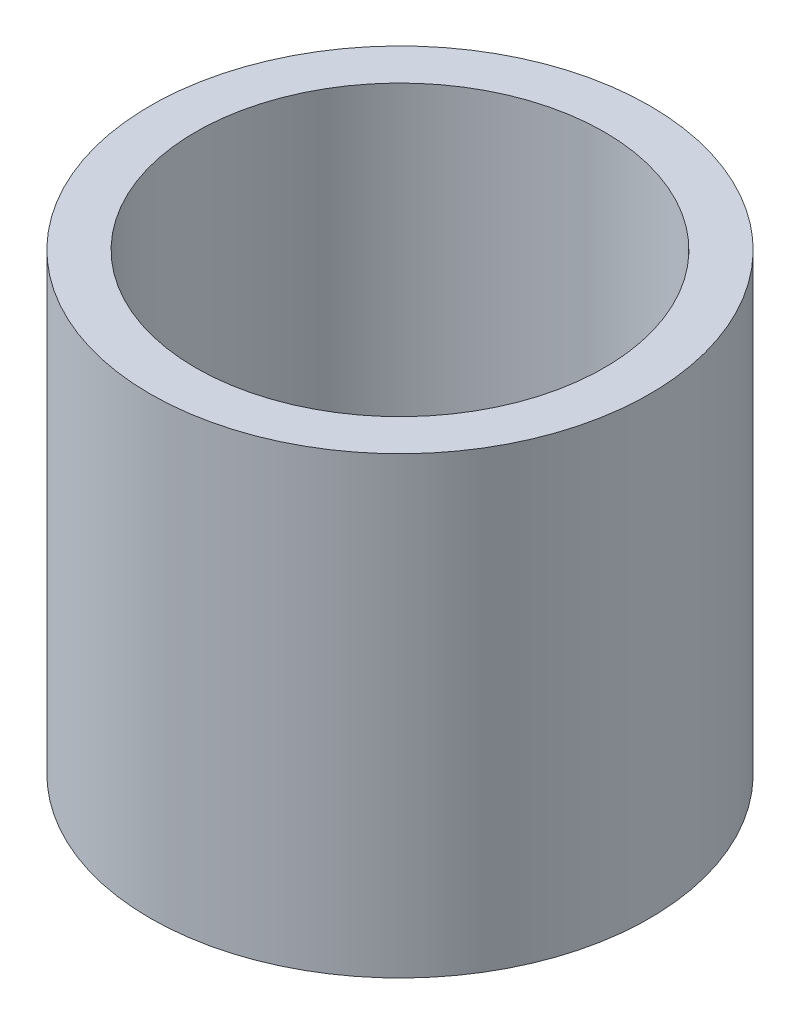
ISO-10303-21;
HEADER;
FILE_DESCRIPTION(('STEP AP214'),'2;1');
FILE_NAME('part.step','',(''),(''),'','','');
FILE_SCHEMA(('AUTOMOTIVE_DESIGN { 1 0 10303 214 1 1 1 1 }'));
ENDSEC;
DATA;
#1=APPLICATION_CONTEXT('core data for automotive mechanical design processes');
#2=APPLICATION_PROTOCOL_DEFINITION('international standard','automotive_design',2000,#1);
#3=PRODUCT_CONTEXT('',#1,'mechanical');
#4=PRODUCT('Part','Part','',(#3));
#5=PRODUCT_RELATED_PRODUCT_CATEGORY('part','',(#4));
#6=PRODUCT_DEFINITION_FORMATION('','',#4);
#7=PRODUCT_DEFINITION_CONTEXT('part definition',#1,'design');
#8=PRODUCT_DEFINITION('design','',#6,#7);
#9=PRODUCT_DEFINITION_SHAPE('','',#8);
#10=(LENGTH_UNIT() NAMED_UNIT(*) SI_UNIT(.MILLI.,.METRE.));
#11=(NAMED_UNIT(*) PLANE_ANGLE_UNIT() SI_UNIT($,.RADIAN.));
#12=(NAMED_UNIT(*) SI_UNIT($,.STERADIAN.) SOLID_ANGLE_UNIT());
#13=UNCERTAINTY_MEASURE_WITH_UNIT(LENGTH_MEASURE(1.E-05),#10,'distance_accuracy_value','');
#14=(GEOMETRIC_REPRESENTATION_CONTEXT(3) GLOBAL_UNCERTAINTY_ASSIGNED_CONTEXT((#13)) GLOBAL_UNIT_ASSIGNED_CONTEXT((#10,
#11,#12)) REPRESENTATION_CONTEXT('',''));
#15=CARTESIAN_POINT('',(0.,0.,0.));
#16=DIRECTION('',(0.,0.,1.));
#17=DIRECTION('',(1.,0.,0.));
#18=AXIS2_PLACEMENT_3D('',#15,#16,#17);
#19=CARTESIAN_POINT('',(0.,15.875,0.));
#20=DIRECTION('',(0.,1.,0.));
#21=DIRECTION('',(0.,0.,1.));
#22=AXIS2_PLACEMENT_3D('',#19,#20,#21);
#23=PLANE('',#22);
#24=CARTESIAN_POINT('',(0.,15.875,0.));
#25=DIRECTION('',(0.,1.,0.));
#26=DIRECTION('',(0.,0.,1.));
#27=AXIS2_PLACEMENT_3D('',#24,#25,#26);
#28=CIRCLE('',#27,8.73125);
#29=CARTESIAN_POINT('',(0.,15.875,8.73125));
#30=VERTEX_POINT('',#29);
#31=EDGE_CURVE('E10',#30,#30,#28,.T.);
#32=ORIENTED_EDGE('',*,*,#31,.T.);
#33=EDGE_LOOP('',(#32));
#34=FACE_BOUND('',#33,.T.);
#35=CARTESIAN_POINT('',(0.,15.875,0.));
#36=DIRECTION('',(0.,1.,0.));
#37=DIRECTION('',(0.,0.,1.));
#38=AXIS2_PLACEMENT_3D('',#35,#36,#37);
#39=CIRCLE('',#38,7.14375);
#40=CARTESIAN_POINT('',(0.,15.875,7.14375));
#41=VERTEX_POINT('',#40);
#42=EDGE_CURVE('E48',#41,#41,#39,.T.);
#43=ORIENTED_EDGE('',*,*,#42,.F.);
#44=EDGE_LOOP('',(#43));
#45=FACE_BOUND('',#44,.T.);
#46=ADVANCED_FACE('F37',(#34,#45),#23,.T.);
#47=CARTESIAN_POINT('',(0.,0.,0.));
#48=DIRECTION('',(0.,1.,0.));
#49=DIRECTION('',(0.,0.,1.));
#50=AXIS2_PLACEMENT_3D('',#47,#48,#49);
#51=PLANE('',#50);
#52=CARTESIAN_POINT('',(0.,0.,0.));
#53=DIRECTION('',(0.,1.,0.));
#54=DIRECTION('',(0.,0.,1.));
#55=AXIS2_PLACEMENT_3D('',#52,#53,#54);
#56=CIRCLE('',#55,8.73125);
#57=CARTESIAN_POINT('',(0.,0.,8.73125));
#58=VERTEX_POINT('',#57);
#59=EDGE_CURVE('E41',#58,#58,#56,.T.);
#60=ORIENTED_EDGE('',*,*,#59,.F.);
#61=EDGE_LOOP('',(#60));
#62=FACE_BOUND('',#61,.T.);
#63=CARTESIAN_POINT('',(0.,0.,0.));
#64=DIRECTION('',(0.,1.,0.));
#65=DIRECTION('',(0.,0.,1.));
#66=AXIS2_PLACEMENT_3D('',#63,#64,#65);
#67=CIRCLE('',#66,7.14375);
#68=CARTESIAN_POINT('',(0.,0.,7.14375));
#69=VERTEX_POINT('',#68);
#70=EDGE_CURVE('E50',#69,#69,#67,.T.);
#71=ORIENTED_EDGE('',*,*,#70,.T.);
#72=EDGE_LOOP('',(#71));
#73=FACE_BOUND('',#72,.T.);
#74=ADVANCED_FACE('F60',(#62,#73),#51,.F.);
#75=CARTESIAN_POINT('',(0.,15.875,0.));
#76=DIRECTION('',(0.,-1.,0.));
#77=DIRECTION('',(0.,0.,-1.));
#78=AXIS2_PLACEMENT_3D('',#75,#76,#77);
#79=CYLINDRICAL_SURFACE('',#78,8.73125);
#80=ORIENTED_EDGE('',*,*,#31,.F.);
#81=EDGE_LOOP('',(#80));
#82=FACE_BOUND('',#81,.T.);
#83=ORIENTED_EDGE('',*,*,#59,.T.);
#84=EDGE_LOOP('',(#83));
#85=FACE_BOUND('',#84,.T.);
#86=ADVANCED_FACE('F39',(#82,#85),#79,.T.);
#87=CARTESIAN_POINT('',(0.,15.875,0.));
#88=DIRECTION('',(0.,-1.,0.));
#89=DIRECTION('',(0.,0.,-1.));
#90=AXIS2_PLACEMENT_3D('',#87,#88,#89);
#91=CYLINDRICAL_SURFACE('',#90,7.14375);
#92=ORIENTED_EDGE('',*,*,#42,.T.);
#93=EDGE_LOOP('',(#92));
#94=FACE_BOUND('',#93,.T.);
#95=ORIENTED_EDGE('',*,*,#70,.F.);
#96=EDGE_LOOP('',(#95));
#97=FACE_BOUND('',#96,.T.);
#98=ADVANCED_FACE('F56',(#94,#97),#91,.F.);
#99=CLOSED_SHELL('',(#46,#74,#86,#98));
#100=MANIFOLD_SOLID_BREP('B2',#99);
#101=ADVANCED_BREP_SHAPE_REPRESENTATION('',(#18,#100),#14);
#102=SHAPE_DEFINITION_REPRESENTATION(#9,#101);
ENDSEC;
END-ISO-10303-21;
